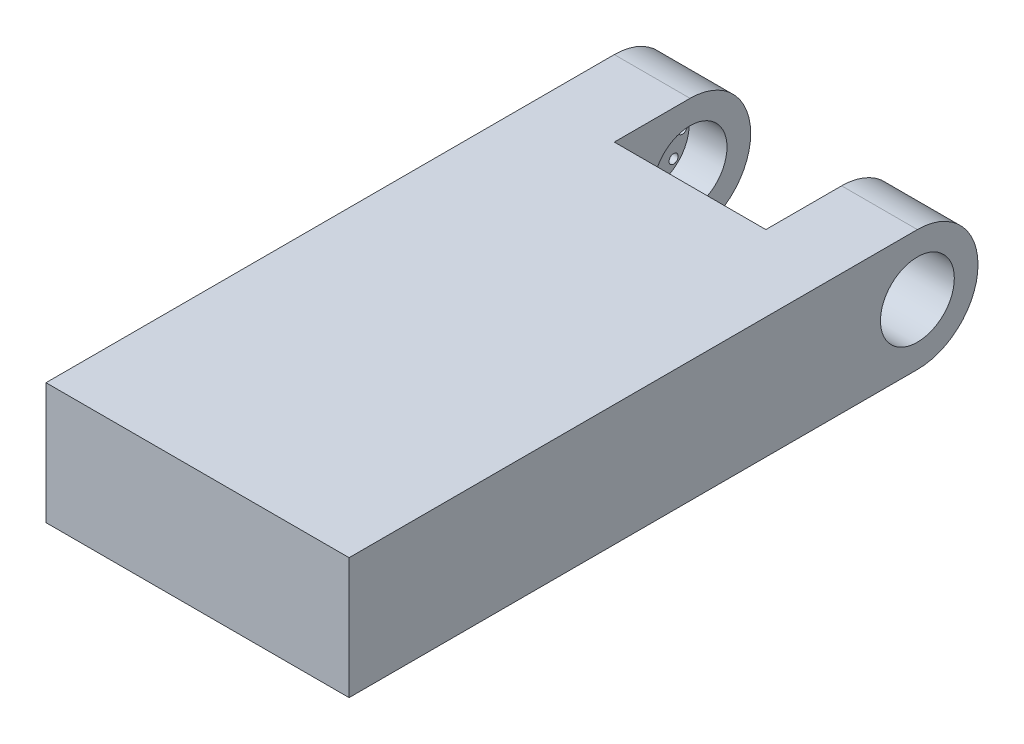
ISO-10303-21;
HEADER;
FILE_DESCRIPTION(('STEP AP214'),'2;1');
FILE_NAME('part.step','',(''),(''),'','','');
FILE_SCHEMA(('AUTOMOTIVE_DESIGN { 1 0 10303 214 1 1 1 1 }'));
ENDSEC;
DATA;
#1=APPLICATION_CONTEXT('core data for automotive mechanical design processes');
#2=APPLICATION_PROTOCOL_DEFINITION('international standard','automotive_design',2000,#1);
#3=PRODUCT_CONTEXT('',#1,'mechanical');
#4=PRODUCT('Part','Part','',(#3));
#5=PRODUCT_RELATED_PRODUCT_CATEGORY('part','',(#4));
#6=PRODUCT_DEFINITION_FORMATION('','',#4);
#7=PRODUCT_DEFINITION_CONTEXT('part definition',#1,'design');
#8=PRODUCT_DEFINITION('design','',#6,#7);
#9=PRODUCT_DEFINITION_SHAPE('','',#8);
#10=(LENGTH_UNIT() NAMED_UNIT(*) SI_UNIT(.MILLI.,.METRE.));
#11=(NAMED_UNIT(*) PLANE_ANGLE_UNIT() SI_UNIT($,.RADIAN.));
#12=(NAMED_UNIT(*) SI_UNIT($,.STERADIAN.) SOLID_ANGLE_UNIT());
#13=UNCERTAINTY_MEASURE_WITH_UNIT(LENGTH_MEASURE(1.E-05),#10,'distance_accuracy_value','');
#14=(GEOMETRIC_REPRESENTATION_CONTEXT(3) GLOBAL_UNCERTAINTY_ASSIGNED_CONTEXT((#13)) GLOBAL_UNIT_ASSIGNED_CONTEXT((#10,
#11,#12)) REPRESENTATION_CONTEXT('',''));
#15=CARTESIAN_POINT('',(0.,0.,0.));
#16=DIRECTION('',(0.,0.,1.));
#17=DIRECTION('',(1.,0.,0.));
#18=AXIS2_PLACEMENT_3D('',#15,#16,#17);
#19=CARTESIAN_POINT('',(80.,16.,-150.));
#20=DIRECTION('',(-1.,0.,0.));
#21=DIRECTION('',(0.,0.,1.));
#22=AXIS2_PLACEMENT_3D('',#19,#20,#21);
#23=CYLINDRICAL_SURFACE('',#22,16.);
#24=CARTESIAN_POINT('',(60.,16.,-150.));
#25=DIRECTION('',(1.,0.,0.));
#26=DIRECTION('',(0.,0.,-1.));
#27=AXIS2_PLACEMENT_3D('',#24,#25,#26);
#28=CIRCLE('',#27,16.);
#29=CARTESIAN_POINT('',(60.,32.,-150.));
#30=VERTEX_POINT('',#29);
#31=CARTESIAN_POINT('',(60.,0.,-150.));
#32=VERTEX_POINT('',#31);
#33=EDGE_CURVE('E147',#30,#32,#28,.F.);
#34=ORIENTED_EDGE('',*,*,#33,.F.);
#35=DIRECTION('',(-1.,0.,0.));
#36=VECTOR('',#35,1.);
#37=CARTESIAN_POINT('',(80.,32.,-150.));
#38=LINE('',#37,#36);
#39=CARTESIAN_POINT('',(80.,32.,-150.));
#40=VERTEX_POINT('',#39);
#41=EDGE_CURVE('E189',#40,#30,#38,.T.);
#42=ORIENTED_EDGE('',*,*,#41,.F.);
#43=CARTESIAN_POINT('',(80.,16.,-150.));
#44=DIRECTION('',(-1.,0.,0.));
#45=DIRECTION('',(0.,0.,1.));
#46=AXIS2_PLACEMENT_3D('',#43,#44,#45);
#47=CIRCLE('',#46,16.);
#48=CARTESIAN_POINT('',(80.,0.,-150.));
#49=VERTEX_POINT('',#48);
#50=EDGE_CURVE('E162',#40,#49,#47,.T.);
#51=ORIENTED_EDGE('',*,*,#50,.T.);
#52=DIRECTION('',(-1.,0.,0.));
#53=VECTOR('',#52,1.);
#54=CARTESIAN_POINT('',(80.,0.,-150.));
#55=LINE('',#54,#53);
#56=EDGE_CURVE('E184',#49,#32,#55,.T.);
#57=ORIENTED_EDGE('',*,*,#56,.T.);
#58=EDGE_LOOP('',(#34,#42,#51,#57));
#59=FACE_BOUND('',#58,.T.);
#60=ADVANCED_FACE('F39',(#59),#23,.T.);
#61=CARTESIAN_POINT('',(80.,0.,0.));
#62=DIRECTION('',(0.,0.,1.));
#63=DIRECTION('',(1.,0.,0.));
#64=AXIS2_PLACEMENT_3D('',#61,#62,#63);
#65=PLANE('',#64);
#66=DIRECTION('',(0.,1.,0.));
#67=VECTOR('',#66,1.);
#68=CARTESIAN_POINT('',(0.,0.,0.));
#69=LINE('',#68,#67);
#70=CARTESIAN_POINT('',(0.,0.,0.));
#71=VERTEX_POINT('',#70);
#72=CARTESIAN_POINT('',(0.,32.,0.));
#73=VERTEX_POINT('',#72);
#74=EDGE_CURVE('E154',#71,#73,#69,.T.);
#75=ORIENTED_EDGE('',*,*,#74,.F.);
#76=DIRECTION('',(-1.,0.,0.));
#77=VECTOR('',#76,1.);
#78=CARTESIAN_POINT('',(80.,0.,0.));
#79=LINE('',#78,#77);
#80=CARTESIAN_POINT('',(80.,0.,0.));
#81=VERTEX_POINT('',#80);
#82=EDGE_CURVE('E49',#81,#71,#79,.T.);
#83=ORIENTED_EDGE('',*,*,#82,.F.);
#84=DIRECTION('',(0.,1.,0.));
#85=VECTOR('',#84,1.);
#86=CARTESIAN_POINT('',(80.,0.,0.));
#87=LINE('',#86,#85);
#88=CARTESIAN_POINT('',(80.,32.,0.));
#89=VERTEX_POINT('',#88);
#90=EDGE_CURVE('E155',#81,#89,#87,.T.);
#91=ORIENTED_EDGE('',*,*,#90,.T.);
#92=DIRECTION('',(-1.,0.,0.));
#93=VECTOR('',#92,1.);
#94=CARTESIAN_POINT('',(80.,32.,0.));
#95=LINE('',#94,#93);
#96=EDGE_CURVE('E89',#89,#73,#95,.T.);
#97=ORIENTED_EDGE('',*,*,#96,.T.);
#98=EDGE_LOOP('',(#75,#83,#91,#97));
#99=FACE_BOUND('',#98,.T.);
#100=ADVANCED_FACE('F41',(#99),#65,.T.);
#101=CARTESIAN_POINT('',(80.,0.,0.));
#102=DIRECTION('',(0.,1.,0.));
#103=DIRECTION('',(0.,0.,1.));
#104=AXIS2_PLACEMENT_3D('',#101,#102,#103);
#105=PLANE('',#104);
#106=DIRECTION('',(1.,0.,0.));
#107=VECTOR('',#106,1.);
#108=CARTESIAN_POINT('',(80.,0.,-130.));
#109=LINE('',#108,#107);
#110=CARTESIAN_POINT('',(20.,0.,-130.));
#111=VERTEX_POINT('',#110);
#112=CARTESIAN_POINT('',(60.,0.,-130.));
#113=VERTEX_POINT('',#112);
#114=EDGE_CURVE('E121',#111,#113,#109,.T.);
#115=ORIENTED_EDGE('',*,*,#114,.T.);
#116=DIRECTION('',(0.,0.,-1.));
#117=VECTOR('',#116,1.);
#118=CARTESIAN_POINT('',(60.,0.,0.));
#119=LINE('',#118,#117);
#120=EDGE_CURVE('E150',#113,#32,#119,.T.);
#121=ORIENTED_EDGE('',*,*,#120,.T.);
#122=ORIENTED_EDGE('',*,*,#56,.F.);
#123=DIRECTION('',(0.,0.,-1.));
#124=VECTOR('',#123,1.);
#125=CARTESIAN_POINT('',(80.,0.,0.));
#126=LINE('',#125,#124);
#127=EDGE_CURVE('E166',#81,#49,#126,.T.);
#128=ORIENTED_EDGE('',*,*,#127,.F.);
#129=ORIENTED_EDGE('',*,*,#82,.T.);
#130=DIRECTION('',(0.,0.,-1.));
#131=VECTOR('',#130,1.);
#132=CARTESIAN_POINT('',(0.,0.,0.));
#133=LINE('',#132,#131);
#134=CARTESIAN_POINT('',(0.,0.,-150.));
#135=VERTEX_POINT('',#134);
#136=EDGE_CURVE('E159',#71,#135,#133,.T.);
#137=ORIENTED_EDGE('',*,*,#136,.T.);
#138=CARTESIAN_POINT('',(20.,0.,-150.));
#139=VERTEX_POINT('',#138);
#140=EDGE_CURVE('E188',#139,#135,#55,.T.);
#141=ORIENTED_EDGE('',*,*,#140,.F.);
#142=DIRECTION('',(0.,0.,1.));
#143=VECTOR('',#142,1.);
#144=CARTESIAN_POINT('',(20.,0.,0.));
#145=LINE('',#144,#143);
#146=EDGE_CURVE('E142',#139,#111,#145,.T.);
#147=ORIENTED_EDGE('',*,*,#146,.T.);
#148=EDGE_LOOP('',(#115,#121,#122,#128,#129,#137,#141,#147));
#149=FACE_BOUND('',#148,.T.);
#150=ADVANCED_FACE('F202',(#149),#105,.F.);
#151=CARTESIAN_POINT('',(20.,16.,-150.));
#152=DIRECTION('',(-1.,0.,0.));
#153=DIRECTION('',(0.,0.,1.));
#154=AXIS2_PLACEMENT_3D('',#151,#152,#153);
#155=CIRCLE('',#154,16.);
#156=CARTESIAN_POINT('',(20.,32.,-150.));
#157=VERTEX_POINT('',#156);
#158=EDGE_CURVE('E55',#139,#157,#155,.F.);
#159=ORIENTED_EDGE('',*,*,#158,.F.);
#160=ORIENTED_EDGE('',*,*,#140,.T.);
#161=CARTESIAN_POINT('',(0.,16.,-150.));
#162=DIRECTION('',(-1.,0.,0.));
#163=DIRECTION('',(0.,0.,1.));
#164=AXIS2_PLACEMENT_3D('',#161,#162,#163);
#165=CIRCLE('',#164,16.);
#166=CARTESIAN_POINT('',(0.,32.,-150.));
#167=VERTEX_POINT('',#166);
#168=EDGE_CURVE('E176',#167,#135,#165,.T.);
#169=ORIENTED_EDGE('',*,*,#168,.F.);
#170=EDGE_CURVE('E192',#157,#167,#38,.T.);
#171=ORIENTED_EDGE('',*,*,#170,.F.);
#172=EDGE_LOOP('',(#159,#160,#169,#171));
#173=FACE_BOUND('',#172,.T.);
#174=ADVANCED_FACE('F197',(#173),#23,.T.);
#175=CARTESIAN_POINT('',(80.,32.,0.));
#176=DIRECTION('',(0.,1.,0.));
#177=DIRECTION('',(0.,0.,1.));
#178=AXIS2_PLACEMENT_3D('',#175,#176,#177);
#179=PLANE('',#178);
#180=DIRECTION('',(0.,0.,-1.));
#181=VECTOR('',#180,1.);
#182=CARTESIAN_POINT('',(60.,32.,-130.));
#183=LINE('',#182,#181);
#184=CARTESIAN_POINT('',(60.,32.,-130.));
#185=VERTEX_POINT('',#184);
#186=EDGE_CURVE('E130',#185,#30,#183,.T.);
#187=ORIENTED_EDGE('',*,*,#186,.F.);
#188=DIRECTION('',(1.,0.,0.));
#189=VECTOR('',#188,1.);
#190=CARTESIAN_POINT('',(20.,32.,-130.));
#191=LINE('',#190,#189);
#192=CARTESIAN_POINT('',(20.,32.,-130.));
#193=VERTEX_POINT('',#192);
#194=EDGE_CURVE('E118',#193,#185,#191,.T.);
#195=ORIENTED_EDGE('',*,*,#194,.F.);
#196=DIRECTION('',(0.,0.,1.));
#197=VECTOR('',#196,1.);
#198=CARTESIAN_POINT('',(20.,32.,0.));
#199=LINE('',#198,#197);
#200=EDGE_CURVE('E11',#157,#193,#199,.T.);
#201=ORIENTED_EDGE('',*,*,#200,.F.);
#202=ORIENTED_EDGE('',*,*,#170,.T.);
#203=DIRECTION('',(0.,0.,-1.));
#204=VECTOR('',#203,1.);
#205=CARTESIAN_POINT('',(0.,32.,0.));
#206=LINE('',#205,#204);
#207=EDGE_CURVE('E172',#73,#167,#206,.T.);
#208=ORIENTED_EDGE('',*,*,#207,.F.);
#209=ORIENTED_EDGE('',*,*,#96,.F.);
#210=DIRECTION('',(0.,0.,-1.));
#211=VECTOR('',#210,1.);
#212=CARTESIAN_POINT('',(80.,32.,0.));
#213=LINE('',#212,#211);
#214=EDGE_CURVE('E158',#89,#40,#213,.T.);
#215=ORIENTED_EDGE('',*,*,#214,.T.);
#216=ORIENTED_EDGE('',*,*,#41,.T.);
#217=EDGE_LOOP('',(#187,#195,#201,#202,#208,#209,#215,#216));
#218=FACE_BOUND('',#217,.T.);
#219=ADVANCED_FACE('F128',(#218),#179,.T.);
#220=CARTESIAN_POINT('',(80.,16.,-150.));
#221=DIRECTION('',(-1.,0.,0.));
#222=DIRECTION('',(0.,0.,1.));
#223=AXIS2_PLACEMENT_3D('',#220,#221,#222);
#224=PLANE('',#223);
#225=CARTESIAN_POINT('',(80.,16.,-150.));
#226=DIRECTION('',(1.,0.,0.));
#227=DIRECTION('',(0.,0.,-1.));
#228=AXIS2_PLACEMENT_3D('',#225,#226,#227);
#229=CIRCLE('',#228,9.74999999999999);
#230=CARTESIAN_POINT('',(80.,16.,-159.75));
#231=VERTEX_POINT('',#230);
#232=EDGE_CURVE('E478',#231,#231,#229,.T.);
#233=ORIENTED_EDGE('',*,*,#232,.F.);
#234=EDGE_LOOP('',(#233));
#235=FACE_BOUND('',#234,.T.);
#236=ORIENTED_EDGE('',*,*,#90,.F.);
#237=ORIENTED_EDGE('',*,*,#127,.T.);
#238=ORIENTED_EDGE('',*,*,#50,.F.);
#239=ORIENTED_EDGE('',*,*,#214,.F.);
#240=EDGE_LOOP('',(#236,#237,#238,#239));
#241=FACE_BOUND('',#240,.T.);
#242=ADVANCED_FACE('F217',(#235,#241),#224,.F.);
#243=CARTESIAN_POINT('',(0.,16.,-150.));
#244=DIRECTION('',(-1.,0.,0.));
#245=DIRECTION('',(0.,0.,1.));
#246=AXIS2_PLACEMENT_3D('',#243,#244,#245);
#247=PLANE('',#246);
#248=CARTESIAN_POINT('',(0.,24.,-150.));
#249=DIRECTION('',(-1.,0.,0.));
#250=DIRECTION('',(0.,0.,1.));
#251=AXIS2_PLACEMENT_3D('',#248,#249,#250);
#252=CIRCLE('',#251,2.4);
#253=CARTESIAN_POINT('',(0.,24.,-147.6));
#254=VERTEX_POINT('',#253);
#255=EDGE_CURVE('E352',#254,#254,#252,.T.);
#256=ORIENTED_EDGE('',*,*,#255,.F.);
#257=EDGE_LOOP('',(#256));
#258=FACE_BOUND('',#257,.T.);
#259=CARTESIAN_POINT('',(0.,21.6568542494926,-144.343145750508));
#260=DIRECTION('',(-1.,0.,0.));
#261=DIRECTION('',(0.,0.,1.));
#262=AXIS2_PLACEMENT_3D('',#259,#260,#261);
#263=CIRCLE('',#262,2.4);
#264=CARTESIAN_POINT('',(0.,21.6568542494926,-141.943145750508));
#265=VERTEX_POINT('',#264);
#266=EDGE_CURVE('E366',#265,#265,#263,.T.);
#267=ORIENTED_EDGE('',*,*,#266,.F.);
#268=EDGE_LOOP('',(#267));
#269=FACE_BOUND('',#268,.T.);
#270=CARTESIAN_POINT('',(0.,16.0000000000002,-142.));
#271=DIRECTION('',(-1.,0.,0.));
#272=DIRECTION('',(0.,0.,1.));
#273=AXIS2_PLACEMENT_3D('',#270,#271,#272);
#274=CIRCLE('',#273,2.4);
#275=CARTESIAN_POINT('',(0.,16.0000000000002,-139.6));
#276=VERTEX_POINT('',#275);
#277=EDGE_CURVE('E382',#276,#276,#274,.T.);
#278=ORIENTED_EDGE('',*,*,#277,.F.);
#279=EDGE_LOOP('',(#278));
#280=FACE_BOUND('',#279,.T.);
#281=CARTESIAN_POINT('',(0.,10.3431457505078,-144.343145750507));
#282=DIRECTION('',(-1.,0.,0.));
#283=DIRECTION('',(0.,0.,1.));
#284=AXIS2_PLACEMENT_3D('',#281,#282,#283);
#285=CIRCLE('',#284,2.4);
#286=CARTESIAN_POINT('',(0.,10.3431457505078,-141.943145750507));
#287=VERTEX_POINT('',#286);
#288=EDGE_CURVE('E398',#287,#287,#285,.T.);
#289=ORIENTED_EDGE('',*,*,#288,.F.);
#290=EDGE_LOOP('',(#289));
#291=FACE_BOUND('',#290,.T.);
#292=CARTESIAN_POINT('',(0.,7.99999999999999,-150.));
#293=DIRECTION('',(-1.,0.,0.));
#294=DIRECTION('',(0.,0.,1.));
#295=AXIS2_PLACEMENT_3D('',#292,#293,#294);
#296=CIRCLE('',#295,2.4);
#297=CARTESIAN_POINT('',(0.,7.99999999999999,-147.6));
#298=VERTEX_POINT('',#297);
#299=EDGE_CURVE('E414',#298,#298,#296,.T.);
#300=ORIENTED_EDGE('',*,*,#299,.F.);
#301=EDGE_LOOP('',(#300));
#302=FACE_BOUND('',#301,.T.);
#303=CARTESIAN_POINT('',(0.,10.3431457505075,-155.656854249492));
#304=DIRECTION('',(-1.,0.,0.));
#305=DIRECTION('',(0.,0.,1.));
#306=AXIS2_PLACEMENT_3D('',#303,#304,#305);
#307=CIRCLE('',#306,2.4);
#308=CARTESIAN_POINT('',(0.,10.3431457505075,-153.256854249492));
#309=VERTEX_POINT('',#308);
#310=EDGE_CURVE('E430',#309,#309,#307,.T.);
#311=ORIENTED_EDGE('',*,*,#310,.F.);
#312=EDGE_LOOP('',(#311));
#313=FACE_BOUND('',#312,.T.);
#314=CARTESIAN_POINT('',(0.,15.9999999999998,-158.));
#315=DIRECTION('',(-1.,0.,0.));
#316=DIRECTION('',(0.,0.,1.));
#317=AXIS2_PLACEMENT_3D('',#314,#315,#316);
#318=CIRCLE('',#317,2.4);
#319=CARTESIAN_POINT('',(0.,15.9999999999998,-155.6));
#320=VERTEX_POINT('',#319);
#321=EDGE_CURVE('E446',#320,#320,#318,.T.);
#322=ORIENTED_EDGE('',*,*,#321,.F.);
#323=EDGE_LOOP('',(#322));
#324=FACE_BOUND('',#323,.T.);
#325=CARTESIAN_POINT('',(0.,21.6568542494923,-155.656854249492));
#326=DIRECTION('',(-1.,0.,0.));
#327=DIRECTION('',(0.,0.,1.));
#328=AXIS2_PLACEMENT_3D('',#325,#326,#327);
#329=CIRCLE('',#328,2.4);
#330=CARTESIAN_POINT('',(0.,21.6568542494923,-153.256854249492));
#331=VERTEX_POINT('',#330);
#332=EDGE_CURVE('E462',#331,#331,#329,.T.);
#333=ORIENTED_EDGE('',*,*,#332,.F.);
#334=EDGE_LOOP('',(#333));
#335=FACE_BOUND('',#334,.T.);
#336=ORIENTED_EDGE('',*,*,#74,.T.);
#337=ORIENTED_EDGE('',*,*,#207,.T.);
#338=ORIENTED_EDGE('',*,*,#168,.T.);
#339=ORIENTED_EDGE('',*,*,#136,.F.);
#340=EDGE_LOOP('',(#336,#337,#338,#339));
#341=FACE_BOUND('',#340,.T.);
#342=ADVANCED_FACE('F200',(#258,#269,#280,#291,#302,#313,#324,#335,#341),#247,.T.);
#343=CARTESIAN_POINT('',(60.,-28.,-130.));
#344=DIRECTION('',(1.,0.,0.));
#345=DIRECTION('',(0.,0.,-1.));
#346=AXIS2_PLACEMENT_3D('',#343,#344,#345);
#347=PLANE('',#346);
#348=CARTESIAN_POINT('',(60.,16.,-150.));
#349=DIRECTION('',(1.,0.,0.));
#350=DIRECTION('',(0.,0.,-1.));
#351=AXIS2_PLACEMENT_3D('',#348,#349,#350);
#352=CIRCLE('',#351,9.74999999999999);
#353=CARTESIAN_POINT('',(60.,16.,-159.75));
#354=VERTEX_POINT('',#353);
#355=EDGE_CURVE('E134',#354,#354,#352,.T.);
#356=ORIENTED_EDGE('',*,*,#355,.T.);
#357=EDGE_LOOP('',(#356));
#358=FACE_BOUND('',#357,.T.);
#359=DIRECTION('',(0.,1.,0.));
#360=VECTOR('',#359,1.);
#361=CARTESIAN_POINT('',(60.,-28.,-130.));
#362=LINE('',#361,#360);
#363=EDGE_CURVE('E124',#113,#185,#362,.T.);
#364=ORIENTED_EDGE('',*,*,#363,.T.);
#365=ORIENTED_EDGE('',*,*,#186,.T.);
#366=ORIENTED_EDGE('',*,*,#33,.T.);
#367=ORIENTED_EDGE('',*,*,#120,.F.);
#368=EDGE_LOOP('',(#364,#365,#366,#367));
#369=FACE_BOUND('',#368,.T.);
#370=ADVANCED_FACE('F226',(#358,#369),#347,.F.);
#371=CARTESIAN_POINT('',(20.,-28.,-130.));
#372=DIRECTION('',(0.,0.,1.));
#373=DIRECTION('',(1.,0.,0.));
#374=AXIS2_PLACEMENT_3D('',#371,#372,#373);
#375=PLANE('',#374);
#376=DIRECTION('',(0.,1.,0.));
#377=VECTOR('',#376,1.);
#378=CARTESIAN_POINT('',(20.,-28.,-130.));
#379=LINE('',#378,#377);
#380=EDGE_CURVE('E114',#111,#193,#379,.T.);
#381=ORIENTED_EDGE('',*,*,#380,.T.);
#382=ORIENTED_EDGE('',*,*,#194,.T.);
#383=ORIENTED_EDGE('',*,*,#363,.F.);
#384=ORIENTED_EDGE('',*,*,#114,.F.);
#385=EDGE_LOOP('',(#381,#382,#383,#384));
#386=FACE_BOUND('',#385,.T.);
#387=ADVANCED_FACE('F115',(#386),#375,.F.);
#388=CARTESIAN_POINT('',(20.,-28.,-130.));
#389=DIRECTION('',(-1.,0.,0.));
#390=DIRECTION('',(0.,0.,1.));
#391=AXIS2_PLACEMENT_3D('',#388,#389,#390);
#392=PLANE('',#391);
#393=CARTESIAN_POINT('',(20.,16.,-150.));
#394=DIRECTION('',(-1.,0.,0.));
#395=DIRECTION('',(0.,0.,1.));
#396=AXIS2_PLACEMENT_3D('',#393,#394,#395);
#397=CIRCLE('',#396,9.74999999999999);
#398=CARTESIAN_POINT('',(20.,16.,-140.25));
#399=VERTEX_POINT('',#398);
#400=EDGE_CURVE('E43',#399,#399,#397,.T.);
#401=ORIENTED_EDGE('',*,*,#400,.T.);
#402=EDGE_LOOP('',(#401));
#403=FACE_BOUND('',#402,.T.);
#404=ORIENTED_EDGE('',*,*,#158,.T.);
#405=ORIENTED_EDGE('',*,*,#200,.T.);
#406=ORIENTED_EDGE('',*,*,#380,.F.);
#407=ORIENTED_EDGE('',*,*,#146,.F.);
#408=EDGE_LOOP('',(#404,#405,#406,#407));
#409=FACE_BOUND('',#408,.T.);
#410=ADVANCED_FACE('F126',(#403,#409),#392,.F.);
#411=CARTESIAN_POINT('',(9.99999999999999,16.,-150.));
#412=DIRECTION('',(1.,0.,0.));
#413=DIRECTION('',(0.,0.,-1.));
#414=AXIS2_PLACEMENT_3D('',#411,#412,#413);
#415=PLANE('',#414);
#416=CARTESIAN_POINT('',(9.99999999999999,24.,-150.));
#417=DIRECTION('',(1.,0.,0.));
#418=DIRECTION('',(0.,0.,-1.));
#419=AXIS2_PLACEMENT_3D('',#416,#417,#418);
#420=CIRCLE('',#419,1.2);
#421=CARTESIAN_POINT('',(9.99999999999999,24.,-151.2));
#422=VERTEX_POINT('',#421);
#423=EDGE_CURVE('E362',#422,#422,#420,.T.);
#424=ORIENTED_EDGE('',*,*,#423,.F.);
#425=EDGE_LOOP('',(#424));
#426=FACE_BOUND('',#425,.T.);
#427=CARTESIAN_POINT('',(9.99999999999999,21.6568542494926,-144.343145750508));
#428=DIRECTION('',(1.,0.,0.));
#429=DIRECTION('',(0.,0.,-1.));
#430=AXIS2_PLACEMENT_3D('',#427,#428,#429);
#431=CIRCLE('',#430,1.2);
#432=CARTESIAN_POINT('',(9.99999999999999,21.6568542494926,-145.543145750508));
#433=VERTEX_POINT('',#432);
#434=EDGE_CURVE('E378',#433,#433,#431,.T.);
#435=ORIENTED_EDGE('',*,*,#434,.F.);
#436=EDGE_LOOP('',(#435));
#437=FACE_BOUND('',#436,.T.);
#438=CARTESIAN_POINT('',(9.99999999999999,16.0000000000002,-142.));
#439=DIRECTION('',(1.,0.,0.));
#440=DIRECTION('',(0.,0.,-1.));
#441=AXIS2_PLACEMENT_3D('',#438,#439,#440);
#442=CIRCLE('',#441,1.2);
#443=CARTESIAN_POINT('',(9.99999999999999,16.0000000000002,-143.2));
#444=VERTEX_POINT('',#443);
#445=EDGE_CURVE('E394',#444,#444,#442,.T.);
#446=ORIENTED_EDGE('',*,*,#445,.F.);
#447=EDGE_LOOP('',(#446));
#448=FACE_BOUND('',#447,.T.);
#449=CARTESIAN_POINT('',(9.99999999999999,10.3431457505078,-144.343145750507));
#450=DIRECTION('',(1.,0.,0.));
#451=DIRECTION('',(0.,0.,-1.));
#452=AXIS2_PLACEMENT_3D('',#449,#450,#451);
#453=CIRCLE('',#452,1.2);
#454=CARTESIAN_POINT('',(9.99999999999999,10.3431457505078,-145.543145750507));
#455=VERTEX_POINT('',#454);
#456=EDGE_CURVE('E410',#455,#455,#453,.T.);
#457=ORIENTED_EDGE('',*,*,#456,.F.);
#458=EDGE_LOOP('',(#457));
#459=FACE_BOUND('',#458,.T.);
#460=CARTESIAN_POINT('',(9.99999999999999,7.99999999999999,-150.));
#461=DIRECTION('',(1.,0.,0.));
#462=DIRECTION('',(0.,0.,-1.));
#463=AXIS2_PLACEMENT_3D('',#460,#461,#462);
#464=CIRCLE('',#463,1.2);
#465=CARTESIAN_POINT('',(9.99999999999999,7.99999999999999,-151.2));
#466=VERTEX_POINT('',#465);
#467=EDGE_CURVE('E426',#466,#466,#464,.T.);
#468=ORIENTED_EDGE('',*,*,#467,.F.);
#469=EDGE_LOOP('',(#468));
#470=FACE_BOUND('',#469,.T.);
#471=CARTESIAN_POINT('',(9.99999999999999,10.3431457505075,-155.656854249492));
#472=DIRECTION('',(1.,0.,0.));
#473=DIRECTION('',(0.,0.,-1.));
#474=AXIS2_PLACEMENT_3D('',#471,#472,#473);
#475=CIRCLE('',#474,1.2);
#476=CARTESIAN_POINT('',(9.99999999999999,10.3431457505075,-156.856854249492));
#477=VERTEX_POINT('',#476);
#478=EDGE_CURVE('E442',#477,#477,#475,.T.);
#479=ORIENTED_EDGE('',*,*,#478,.F.);
#480=EDGE_LOOP('',(#479));
#481=FACE_BOUND('',#480,.T.);
#482=CARTESIAN_POINT('',(9.99999999999999,15.9999999999998,-158.));
#483=DIRECTION('',(1.,0.,0.));
#484=DIRECTION('',(0.,0.,-1.));
#485=AXIS2_PLACEMENT_3D('',#482,#483,#484);
#486=CIRCLE('',#485,1.2);
#487=CARTESIAN_POINT('',(9.99999999999999,15.9999999999998,-159.2));
#488=VERTEX_POINT('',#487);
#489=EDGE_CURVE('E458',#488,#488,#486,.T.);
#490=ORIENTED_EDGE('',*,*,#489,.F.);
#491=EDGE_LOOP('',(#490));
#492=FACE_BOUND('',#491,.T.);
#493=CARTESIAN_POINT('',(9.99999999999999,21.6568542494923,-155.656854249492));
#494=DIRECTION('',(1.,0.,0.));
#495=DIRECTION('',(0.,0.,-1.));
#496=AXIS2_PLACEMENT_3D('',#493,#494,#495);
#497=CIRCLE('',#496,1.2);
#498=CARTESIAN_POINT('',(9.99999999999999,21.6568542494923,-156.856854249492));
#499=VERTEX_POINT('',#498);
#500=EDGE_CURVE('E474',#499,#499,#497,.T.);
#501=ORIENTED_EDGE('',*,*,#500,.F.);
#502=EDGE_LOOP('',(#501));
#503=FACE_BOUND('',#502,.T.);
#504=CARTESIAN_POINT('',(9.99999999999999,16.,-150.));
#505=DIRECTION('',(1.,0.,0.));
#506=DIRECTION('',(0.,0.,-1.));
#507=AXIS2_PLACEMENT_3D('',#504,#505,#506);
#508=CIRCLE('',#507,9.74999999999999);
#509=CARTESIAN_POINT('',(9.99999999999999,16.,-159.75));
#510=VERTEX_POINT('',#509);
#511=EDGE_CURVE('E479',#510,#510,#508,.T.);
#512=ORIENTED_EDGE('',*,*,#511,.T.);
#513=EDGE_LOOP('',(#512));
#514=FACE_BOUND('',#513,.T.);
#515=ADVANCED_FACE('F237',(#426,#437,#448,#459,#470,#481,#492,#503,#514),#415,.T.);
#516=CARTESIAN_POINT('',(9.99999999999999,16.,-150.));
#517=DIRECTION('',(1.,0.,0.));
#518=DIRECTION('',(0.,0.,-1.));
#519=AXIS2_PLACEMENT_3D('',#516,#517,#518);
#520=CYLINDRICAL_SURFACE('',#519,9.74999999999999);
#521=ORIENTED_EDGE('',*,*,#511,.F.);
#522=EDGE_LOOP('',(#521));
#523=FACE_BOUND('',#522,.T.);
#524=ORIENTED_EDGE('',*,*,#400,.F.);
#525=EDGE_LOOP('',(#524));
#526=FACE_BOUND('',#525,.T.);
#527=ADVANCED_FACE('F245',(#523,#526),#520,.F.);
#528=ORIENTED_EDGE('',*,*,#232,.T.);
#529=EDGE_LOOP('',(#528));
#530=FACE_BOUND('',#529,.T.);
#531=ORIENTED_EDGE('',*,*,#355,.F.);
#532=EDGE_LOOP('',(#531));
#533=FACE_BOUND('',#532,.T.);
#534=ADVANCED_FACE('F241',(#530,#533),#520,.F.);
#535=CARTESIAN_POINT('',(0.,21.6568542494923,-155.656854249492));
#536=DIRECTION('',(-1.,0.,0.));
#537=DIRECTION('',(0.,0.,1.));
#538=AXIS2_PLACEMENT_3D('',#535,#536,#537);
#539=CYLINDRICAL_SURFACE('',#538,1.2);
#540=CARTESIAN_POINT('',(1.4,21.6568542494923,-155.656854249492));
#541=DIRECTION('',(-1.,0.,0.));
#542=DIRECTION('',(0.,0.,1.));
#543=AXIS2_PLACEMENT_3D('',#540,#541,#542);
#544=CIRCLE('',#543,1.20000000000001);
#545=CARTESIAN_POINT('',(1.4,21.6568542494923,-154.456854249492));
#546=VERTEX_POINT('',#545);
#547=EDGE_CURVE('E470',#546,#546,#544,.T.);
#548=ORIENTED_EDGE('',*,*,#547,.T.);
#549=EDGE_LOOP('',(#548));
#550=FACE_BOUND('',#549,.T.);
#551=ORIENTED_EDGE('',*,*,#500,.T.);
#552=EDGE_LOOP('',(#551));
#553=FACE_BOUND('',#552,.T.);
#554=ADVANCED_FACE('F244',(#550,#553),#539,.F.);
#555=CARTESIAN_POINT('',(1.4,22.8568542494923,-155.656854249492));
#556=DIRECTION('',(1.,0.,0.));
#557=DIRECTION('',(0.,0.,-1.));
#558=AXIS2_PLACEMENT_3D('',#555,#556,#557);
#559=PLANE('',#558);
#560=ORIENTED_EDGE('',*,*,#547,.F.);
#561=EDGE_LOOP('',(#560));
#562=FACE_BOUND('',#561,.T.);
#563=CARTESIAN_POINT('',(1.4,21.6568542494923,-155.656854249492));
#564=DIRECTION('',(-1.,0.,0.));
#565=DIRECTION('',(0.,0.,1.));
#566=AXIS2_PLACEMENT_3D('',#563,#564,#565);
#567=CIRCLE('',#566,2.4);
#568=CARTESIAN_POINT('',(1.4,21.6568542494923,-153.256854249492));
#569=VERTEX_POINT('',#568);
#570=EDGE_CURVE('E466',#569,#569,#567,.T.);
#571=ORIENTED_EDGE('',*,*,#570,.T.);
#572=EDGE_LOOP('',(#571));
#573=FACE_BOUND('',#572,.T.);
#574=ADVANCED_FACE('F252',(#562,#573),#559,.F.);
#575=CARTESIAN_POINT('',(0.,21.6568542494923,-155.656854249492));
#576=DIRECTION('',(-1.,0.,0.));
#577=DIRECTION('',(0.,0.,1.));
#578=AXIS2_PLACEMENT_3D('',#575,#576,#577);
#579=CYLINDRICAL_SURFACE('',#578,2.4);
#580=ORIENTED_EDGE('',*,*,#570,.F.);
#581=EDGE_LOOP('',(#580));
#582=FACE_BOUND('',#581,.T.);
#583=ORIENTED_EDGE('',*,*,#332,.T.);
#584=EDGE_LOOP('',(#583));
#585=FACE_BOUND('',#584,.T.);
#586=ADVANCED_FACE('F256',(#582,#585),#579,.F.);
#587=CARTESIAN_POINT('',(0.,15.9999999999998,-158.));
#588=DIRECTION('',(-1.,0.,0.));
#589=DIRECTION('',(0.,0.,1.));
#590=AXIS2_PLACEMENT_3D('',#587,#588,#589);
#591=CYLINDRICAL_SURFACE('',#590,1.2);
#592=CARTESIAN_POINT('',(1.4,15.9999999999998,-158.));
#593=DIRECTION('',(-1.,0.,0.));
#594=DIRECTION('',(0.,0.,1.));
#595=AXIS2_PLACEMENT_3D('',#592,#593,#594);
#596=CIRCLE('',#595,1.20000000000001);
#597=CARTESIAN_POINT('',(1.4,15.9999999999998,-156.8));
#598=VERTEX_POINT('',#597);
#599=EDGE_CURVE('E454',#598,#598,#596,.T.);
#600=ORIENTED_EDGE('',*,*,#599,.T.);
#601=EDGE_LOOP('',(#600));
#602=FACE_BOUND('',#601,.T.);
#603=ORIENTED_EDGE('',*,*,#489,.T.);
#604=EDGE_LOOP('',(#603));
#605=FACE_BOUND('',#604,.T.);
#606=ADVANCED_FACE('F260',(#602,#605),#591,.F.);
#607=CARTESIAN_POINT('',(1.4,17.1999999999999,-158.));
#608=DIRECTION('',(1.,0.,0.));
#609=DIRECTION('',(0.,0.,-1.));
#610=AXIS2_PLACEMENT_3D('',#607,#608,#609);
#611=PLANE('',#610);
#612=ORIENTED_EDGE('',*,*,#599,.F.);
#613=EDGE_LOOP('',(#612));
#614=FACE_BOUND('',#613,.T.);
#615=CARTESIAN_POINT('',(1.4,15.9999999999998,-158.));
#616=DIRECTION('',(-1.,0.,0.));
#617=DIRECTION('',(0.,0.,1.));
#618=AXIS2_PLACEMENT_3D('',#615,#616,#617);
#619=CIRCLE('',#618,2.4);
#620=CARTESIAN_POINT('',(1.4,15.9999999999998,-155.6));
#621=VERTEX_POINT('',#620);
#622=EDGE_CURVE('E450',#621,#621,#619,.T.);
#623=ORIENTED_EDGE('',*,*,#622,.T.);
#624=EDGE_LOOP('',(#623));
#625=FACE_BOUND('',#624,.T.);
#626=ADVANCED_FACE('F264',(#614,#625),#611,.F.);
#627=CARTESIAN_POINT('',(0.,15.9999999999998,-158.));
#628=DIRECTION('',(-1.,0.,0.));
#629=DIRECTION('',(0.,0.,1.));
#630=AXIS2_PLACEMENT_3D('',#627,#628,#629);
#631=CYLINDRICAL_SURFACE('',#630,2.4);
#632=ORIENTED_EDGE('',*,*,#622,.F.);
#633=EDGE_LOOP('',(#632));
#634=FACE_BOUND('',#633,.T.);
#635=ORIENTED_EDGE('',*,*,#321,.T.);
#636=EDGE_LOOP('',(#635));
#637=FACE_BOUND('',#636,.T.);
#638=ADVANCED_FACE('F268',(#634,#637),#631,.F.);
#639=CARTESIAN_POINT('',(0.,10.3431457505075,-155.656854249492));
#640=DIRECTION('',(-1.,0.,0.));
#641=DIRECTION('',(0.,0.,1.));
#642=AXIS2_PLACEMENT_3D('',#639,#640,#641);
#643=CYLINDRICAL_SURFACE('',#642,1.2);
#644=CARTESIAN_POINT('',(1.4,10.3431457505075,-155.656854249492));
#645=DIRECTION('',(-1.,0.,0.));
#646=DIRECTION('',(0.,0.,1.));
#647=AXIS2_PLACEMENT_3D('',#644,#645,#646);
#648=CIRCLE('',#647,1.20000000000001);
#649=CARTESIAN_POINT('',(1.4,10.3431457505075,-154.456854249492));
#650=VERTEX_POINT('',#649);
#651=EDGE_CURVE('E438',#650,#650,#648,.T.);
#652=ORIENTED_EDGE('',*,*,#651,.T.);
#653=EDGE_LOOP('',(#652));
#654=FACE_BOUND('',#653,.T.);
#655=ORIENTED_EDGE('',*,*,#478,.T.);
#656=EDGE_LOOP('',(#655));
#657=FACE_BOUND('',#656,.T.);
#658=ADVANCED_FACE('F272',(#654,#657),#643,.F.);
#659=CARTESIAN_POINT('',(1.4,11.5431457505075,-155.656854249492));
#660=DIRECTION('',(1.,0.,0.));
#661=DIRECTION('',(0.,0.,-1.));
#662=AXIS2_PLACEMENT_3D('',#659,#660,#661);
#663=PLANE('',#662);
#664=ORIENTED_EDGE('',*,*,#651,.F.);
#665=EDGE_LOOP('',(#664));
#666=FACE_BOUND('',#665,.T.);
#667=CARTESIAN_POINT('',(1.4,10.3431457505075,-155.656854249492));
#668=DIRECTION('',(-1.,0.,0.));
#669=DIRECTION('',(0.,0.,1.));
#670=AXIS2_PLACEMENT_3D('',#667,#668,#669);
#671=CIRCLE('',#670,2.4);
#672=CARTESIAN_POINT('',(1.4,10.3431457505075,-153.256854249492));
#673=VERTEX_POINT('',#672);
#674=EDGE_CURVE('E434',#673,#673,#671,.T.);
#675=ORIENTED_EDGE('',*,*,#674,.T.);
#676=EDGE_LOOP('',(#675));
#677=FACE_BOUND('',#676,.T.);
#678=ADVANCED_FACE('F276',(#666,#677),#663,.F.);
#679=CARTESIAN_POINT('',(0.,10.3431457505075,-155.656854249492));
#680=DIRECTION('',(-1.,0.,0.));
#681=DIRECTION('',(0.,0.,1.));
#682=AXIS2_PLACEMENT_3D('',#679,#680,#681);
#683=CYLINDRICAL_SURFACE('',#682,2.4);
#684=ORIENTED_EDGE('',*,*,#674,.F.);
#685=EDGE_LOOP('',(#684));
#686=FACE_BOUND('',#685,.T.);
#687=ORIENTED_EDGE('',*,*,#310,.T.);
#688=EDGE_LOOP('',(#687));
#689=FACE_BOUND('',#688,.T.);
#690=ADVANCED_FACE('F280',(#686,#689),#683,.F.);
#691=CARTESIAN_POINT('',(0.,7.99999999999999,-150.));
#692=DIRECTION('',(-1.,0.,0.));
#693=DIRECTION('',(0.,0.,1.));
#694=AXIS2_PLACEMENT_3D('',#691,#692,#693);
#695=CYLINDRICAL_SURFACE('',#694,1.2);
#696=CARTESIAN_POINT('',(1.4,7.99999999999999,-150.));
#697=DIRECTION('',(-1.,0.,0.));
#698=DIRECTION('',(0.,0.,1.));
#699=AXIS2_PLACEMENT_3D('',#696,#697,#698);
#700=CIRCLE('',#699,1.20000000000001);
#701=CARTESIAN_POINT('',(1.4,7.99999999999999,-148.8));
#702=VERTEX_POINT('',#701);
#703=EDGE_CURVE('E422',#702,#702,#700,.T.);
#704=ORIENTED_EDGE('',*,*,#703,.T.);
#705=EDGE_LOOP('',(#704));
#706=FACE_BOUND('',#705,.T.);
#707=ORIENTED_EDGE('',*,*,#467,.T.);
#708=EDGE_LOOP('',(#707));
#709=FACE_BOUND('',#708,.T.);
#710=ADVANCED_FACE('F284',(#706,#709),#695,.F.);
#711=CARTESIAN_POINT('',(1.4,9.2,-150.));
#712=DIRECTION('',(1.,0.,0.));
#713=DIRECTION('',(0.,0.,-1.));
#714=AXIS2_PLACEMENT_3D('',#711,#712,#713);
#715=PLANE('',#714);
#716=ORIENTED_EDGE('',*,*,#703,.F.);
#717=EDGE_LOOP('',(#716));
#718=FACE_BOUND('',#717,.T.);
#719=CARTESIAN_POINT('',(1.4,7.99999999999999,-150.));
#720=DIRECTION('',(-1.,0.,0.));
#721=DIRECTION('',(0.,0.,1.));
#722=AXIS2_PLACEMENT_3D('',#719,#720,#721);
#723=CIRCLE('',#722,2.4);
#724=CARTESIAN_POINT('',(1.4,7.99999999999999,-147.6));
#725=VERTEX_POINT('',#724);
#726=EDGE_CURVE('E418',#725,#725,#723,.T.);
#727=ORIENTED_EDGE('',*,*,#726,.T.);
#728=EDGE_LOOP('',(#727));
#729=FACE_BOUND('',#728,.T.);
#730=ADVANCED_FACE('F288',(#718,#729),#715,.F.);
#731=CARTESIAN_POINT('',(0.,7.99999999999999,-150.));
#732=DIRECTION('',(-1.,0.,0.));
#733=DIRECTION('',(0.,0.,1.));
#734=AXIS2_PLACEMENT_3D('',#731,#732,#733);
#735=CYLINDRICAL_SURFACE('',#734,2.4);
#736=ORIENTED_EDGE('',*,*,#726,.F.);
#737=EDGE_LOOP('',(#736));
#738=FACE_BOUND('',#737,.T.);
#739=ORIENTED_EDGE('',*,*,#299,.T.);
#740=EDGE_LOOP('',(#739));
#741=FACE_BOUND('',#740,.T.);
#742=ADVANCED_FACE('F292',(#738,#741),#735,.F.);
#743=CARTESIAN_POINT('',(0.,10.3431457505078,-144.343145750507));
#744=DIRECTION('',(-1.,0.,0.));
#745=DIRECTION('',(0.,0.,1.));
#746=AXIS2_PLACEMENT_3D('',#743,#744,#745);
#747=CYLINDRICAL_SURFACE('',#746,1.2);
#748=CARTESIAN_POINT('',(1.4,10.3431457505078,-144.343145750507));
#749=DIRECTION('',(-1.,0.,0.));
#750=DIRECTION('',(0.,0.,1.));
#751=AXIS2_PLACEMENT_3D('',#748,#749,#750);
#752=CIRCLE('',#751,1.20000000000001);
#753=CARTESIAN_POINT('',(1.4,10.3431457505078,-143.143145750507));
#754=VERTEX_POINT('',#753);
#755=EDGE_CURVE('E406',#754,#754,#752,.T.);
#756=ORIENTED_EDGE('',*,*,#755,.T.);
#757=EDGE_LOOP('',(#756));
#758=FACE_BOUND('',#757,.T.);
#759=ORIENTED_EDGE('',*,*,#456,.T.);
#760=EDGE_LOOP('',(#759));
#761=FACE_BOUND('',#760,.T.);
#762=ADVANCED_FACE('F296',(#758,#761),#747,.F.);
#763=CARTESIAN_POINT('',(1.4,11.5431457505078,-144.343145750507));
#764=DIRECTION('',(1.,0.,0.));
#765=DIRECTION('',(0.,0.,-1.));
#766=AXIS2_PLACEMENT_3D('',#763,#764,#765);
#767=PLANE('',#766);
#768=ORIENTED_EDGE('',*,*,#755,.F.);
#769=EDGE_LOOP('',(#768));
#770=FACE_BOUND('',#769,.T.);
#771=CARTESIAN_POINT('',(1.4,10.3431457505078,-144.343145750507));
#772=DIRECTION('',(-1.,0.,0.));
#773=DIRECTION('',(0.,0.,1.));
#774=AXIS2_PLACEMENT_3D('',#771,#772,#773);
#775=CIRCLE('',#774,2.4);
#776=CARTESIAN_POINT('',(1.4,10.3431457505078,-141.943145750507));
#777=VERTEX_POINT('',#776);
#778=EDGE_CURVE('E402',#777,#777,#775,.T.);
#779=ORIENTED_EDGE('',*,*,#778,.T.);
#780=EDGE_LOOP('',(#779));
#781=FACE_BOUND('',#780,.T.);
#782=ADVANCED_FACE('F300',(#770,#781),#767,.F.);
#783=CARTESIAN_POINT('',(0.,10.3431457505078,-144.343145750507));
#784=DIRECTION('',(-1.,0.,0.));
#785=DIRECTION('',(0.,0.,1.));
#786=AXIS2_PLACEMENT_3D('',#783,#784,#785);
#787=CYLINDRICAL_SURFACE('',#786,2.4);
#788=ORIENTED_EDGE('',*,*,#778,.F.);
#789=EDGE_LOOP('',(#788));
#790=FACE_BOUND('',#789,.T.);
#791=ORIENTED_EDGE('',*,*,#288,.T.);
#792=EDGE_LOOP('',(#791));
#793=FACE_BOUND('',#792,.T.);
#794=ADVANCED_FACE('F304',(#790,#793),#787,.F.);
#795=CARTESIAN_POINT('',(0.,16.0000000000002,-142.));
#796=DIRECTION('',(-1.,0.,0.));
#797=DIRECTION('',(0.,0.,1.));
#798=AXIS2_PLACEMENT_3D('',#795,#796,#797);
#799=CYLINDRICAL_SURFACE('',#798,1.2);
#800=CARTESIAN_POINT('',(1.4,16.0000000000002,-142.));
#801=DIRECTION('',(-1.,0.,0.));
#802=DIRECTION('',(0.,0.,1.));
#803=AXIS2_PLACEMENT_3D('',#800,#801,#802);
#804=CIRCLE('',#803,1.20000000000001);
#805=CARTESIAN_POINT('',(1.4,16.0000000000002,-140.8));
#806=VERTEX_POINT('',#805);
#807=EDGE_CURVE('E390',#806,#806,#804,.T.);
#808=ORIENTED_EDGE('',*,*,#807,.T.);
#809=EDGE_LOOP('',(#808));
#810=FACE_BOUND('',#809,.T.);
#811=ORIENTED_EDGE('',*,*,#445,.T.);
#812=EDGE_LOOP('',(#811));
#813=FACE_BOUND('',#812,.T.);
#814=ADVANCED_FACE('F308',(#810,#813),#799,.F.);
#815=CARTESIAN_POINT('',(1.4,17.2000000000002,-142.));
#816=DIRECTION('',(1.,0.,0.));
#817=DIRECTION('',(0.,0.,-1.));
#818=AXIS2_PLACEMENT_3D('',#815,#816,#817);
#819=PLANE('',#818);
#820=ORIENTED_EDGE('',*,*,#807,.F.);
#821=EDGE_LOOP('',(#820));
#822=FACE_BOUND('',#821,.T.);
#823=CARTESIAN_POINT('',(1.4,16.0000000000002,-142.));
#824=DIRECTION('',(-1.,0.,0.));
#825=DIRECTION('',(0.,0.,1.));
#826=AXIS2_PLACEMENT_3D('',#823,#824,#825);
#827=CIRCLE('',#826,2.4);
#828=CARTESIAN_POINT('',(1.4,16.0000000000002,-139.6));
#829=VERTEX_POINT('',#828);
#830=EDGE_CURVE('E386',#829,#829,#827,.T.);
#831=ORIENTED_EDGE('',*,*,#830,.T.);
#832=EDGE_LOOP('',(#831));
#833=FACE_BOUND('',#832,.T.);
#834=ADVANCED_FACE('F312',(#822,#833),#819,.F.);
#835=CARTESIAN_POINT('',(0.,16.0000000000002,-142.));
#836=DIRECTION('',(-1.,0.,0.));
#837=DIRECTION('',(0.,0.,1.));
#838=AXIS2_PLACEMENT_3D('',#835,#836,#837);
#839=CYLINDRICAL_SURFACE('',#838,2.4);
#840=ORIENTED_EDGE('',*,*,#830,.F.);
#841=EDGE_LOOP('',(#840));
#842=FACE_BOUND('',#841,.T.);
#843=ORIENTED_EDGE('',*,*,#277,.T.);
#844=EDGE_LOOP('',(#843));
#845=FACE_BOUND('',#844,.T.);
#846=ADVANCED_FACE('F316',(#842,#845),#839,.F.);
#847=CARTESIAN_POINT('',(0.,21.6568542494926,-144.343145750508));
#848=DIRECTION('',(-1.,0.,0.));
#849=DIRECTION('',(0.,0.,1.));
#850=AXIS2_PLACEMENT_3D('',#847,#848,#849);
#851=CYLINDRICAL_SURFACE('',#850,1.2);
#852=CARTESIAN_POINT('',(1.4,21.6568542494926,-144.343145750508));
#853=DIRECTION('',(-1.,0.,0.));
#854=DIRECTION('',(0.,0.,1.));
#855=AXIS2_PLACEMENT_3D('',#852,#853,#854);
#856=CIRCLE('',#855,1.20000000000001);
#857=CARTESIAN_POINT('',(1.4,21.6568542494926,-143.143145750508));
#858=VERTEX_POINT('',#857);
#859=EDGE_CURVE('E374',#858,#858,#856,.T.);
#860=ORIENTED_EDGE('',*,*,#859,.T.);
#861=EDGE_LOOP('',(#860));
#862=FACE_BOUND('',#861,.T.);
#863=ORIENTED_EDGE('',*,*,#434,.T.);
#864=EDGE_LOOP('',(#863));
#865=FACE_BOUND('',#864,.T.);
#866=ADVANCED_FACE('F320',(#862,#865),#851,.F.);
#867=CARTESIAN_POINT('',(1.4,22.8568542494926,-144.343145750508));
#868=DIRECTION('',(1.,0.,0.));
#869=DIRECTION('',(0.,0.,-1.));
#870=AXIS2_PLACEMENT_3D('',#867,#868,#869);
#871=PLANE('',#870);
#872=ORIENTED_EDGE('',*,*,#859,.F.);
#873=EDGE_LOOP('',(#872));
#874=FACE_BOUND('',#873,.T.);
#875=CARTESIAN_POINT('',(1.4,21.6568542494926,-144.343145750508));
#876=DIRECTION('',(-1.,0.,0.));
#877=DIRECTION('',(0.,0.,1.));
#878=AXIS2_PLACEMENT_3D('',#875,#876,#877);
#879=CIRCLE('',#878,2.4);
#880=CARTESIAN_POINT('',(1.4,21.6568542494926,-141.943145750508));
#881=VERTEX_POINT('',#880);
#882=EDGE_CURVE('E370',#881,#881,#879,.T.);
#883=ORIENTED_EDGE('',*,*,#882,.T.);
#884=EDGE_LOOP('',(#883));
#885=FACE_BOUND('',#884,.T.);
#886=ADVANCED_FACE('F324',(#874,#885),#871,.F.);
#887=CARTESIAN_POINT('',(0.,21.6568542494926,-144.343145750508));
#888=DIRECTION('',(-1.,0.,0.));
#889=DIRECTION('',(0.,0.,1.));
#890=AXIS2_PLACEMENT_3D('',#887,#888,#889);
#891=CYLINDRICAL_SURFACE('',#890,2.4);
#892=ORIENTED_EDGE('',*,*,#882,.F.);
#893=EDGE_LOOP('',(#892));
#894=FACE_BOUND('',#893,.T.);
#895=ORIENTED_EDGE('',*,*,#266,.T.);
#896=EDGE_LOOP('',(#895));
#897=FACE_BOUND('',#896,.T.);
#898=ADVANCED_FACE('F328',(#894,#897),#891,.F.);
#899=CARTESIAN_POINT('',(0.,24.,-150.));
#900=DIRECTION('',(-1.,0.,0.));
#901=DIRECTION('',(0.,0.,1.));
#902=AXIS2_PLACEMENT_3D('',#899,#900,#901);
#903=CYLINDRICAL_SURFACE('',#902,1.2);
#904=CARTESIAN_POINT('',(1.4,24.,-150.));
#905=DIRECTION('',(-1.,0.,0.));
#906=DIRECTION('',(0.,0.,1.));
#907=AXIS2_PLACEMENT_3D('',#904,#905,#906);
#908=CIRCLE('',#907,1.20000000000001);
#909=CARTESIAN_POINT('',(1.4,24.,-148.8));
#910=VERTEX_POINT('',#909);
#911=EDGE_CURVE('E356',#910,#910,#908,.T.);
#912=ORIENTED_EDGE('',*,*,#911,.T.);
#913=EDGE_LOOP('',(#912));
#914=FACE_BOUND('',#913,.T.);
#915=ORIENTED_EDGE('',*,*,#423,.T.);
#916=EDGE_LOOP('',(#915));
#917=FACE_BOUND('',#916,.T.);
#918=ADVANCED_FACE('F332',(#914,#917),#903,.F.);
#919=CARTESIAN_POINT('',(1.4,25.2,-150.));
#920=DIRECTION('',(1.,0.,0.));
#921=DIRECTION('',(0.,0.,-1.));
#922=AXIS2_PLACEMENT_3D('',#919,#920,#921);
#923=PLANE('',#922);
#924=ORIENTED_EDGE('',*,*,#911,.F.);
#925=EDGE_LOOP('',(#924));
#926=FACE_BOUND('',#925,.T.);
#927=CARTESIAN_POINT('',(1.4,24.,-150.));
#928=DIRECTION('',(-1.,0.,0.));
#929=DIRECTION('',(0.,0.,1.));
#930=AXIS2_PLACEMENT_3D('',#927,#928,#929);
#931=CIRCLE('',#930,2.4);
#932=CARTESIAN_POINT('',(1.4,24.,-147.6));
#933=VERTEX_POINT('',#932);
#934=EDGE_CURVE('E349',#933,#933,#931,.T.);
#935=ORIENTED_EDGE('',*,*,#934,.T.);
#936=EDGE_LOOP('',(#935));
#937=FACE_BOUND('',#936,.T.);
#938=ADVANCED_FACE('F336',(#926,#937),#923,.F.);
#939=CARTESIAN_POINT('',(0.,24.,-150.));
#940=DIRECTION('',(-1.,0.,0.));
#941=DIRECTION('',(0.,0.,1.));
#942=AXIS2_PLACEMENT_3D('',#939,#940,#941);
#943=CYLINDRICAL_SURFACE('',#942,2.4);
#944=ORIENTED_EDGE('',*,*,#934,.F.);
#945=EDGE_LOOP('',(#944));
#946=FACE_BOUND('',#945,.T.);
#947=ORIENTED_EDGE('',*,*,#255,.T.);
#948=EDGE_LOOP('',(#947));
#949=FACE_BOUND('',#948,.T.);
#950=ADVANCED_FACE('F340',(#946,#949),#943,.F.);
#951=CLOSED_SHELL('',(#60,#100,#150,#174,#219,#242,#342,#370,#387,#410,#515,#527,#534,#554,#574,
#586,#606,#626,#638,#658,#678,#690,#710,#730,#742,#762,#782,#794,#814,#834,#846,#866,#886,#898,
#918,#938,#950));
#952=MANIFOLD_SOLID_BREP('B2',#951);
#953=ADVANCED_BREP_SHAPE_REPRESENTATION('',(#18,#952),#14);
#954=SHAPE_DEFINITION_REPRESENTATION(#9,#953);
ENDSEC;
END-ISO-10303-21;
